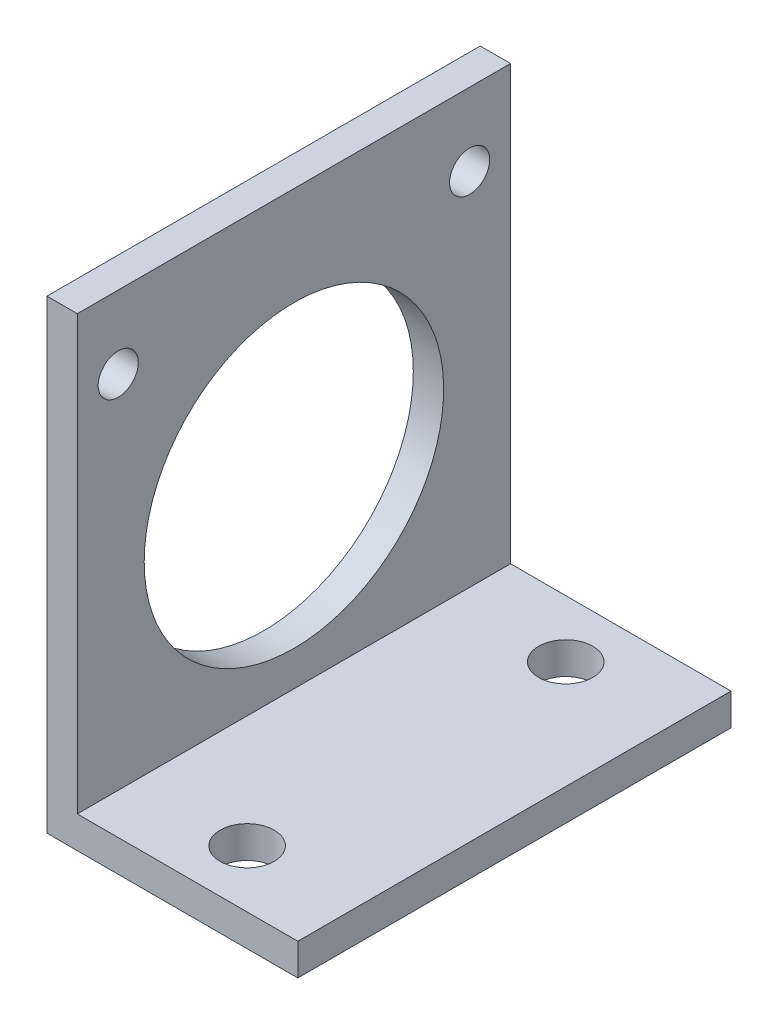
ISO-10303-21;
HEADER;
FILE_DESCRIPTION(('STEP AP214'),'2;1');
FILE_NAME('part.step','',(''),(''),'','','');
FILE_SCHEMA(('AUTOMOTIVE_DESIGN { 1 0 10303 214 1 1 1 1 }'));
ENDSEC;
DATA;
#1=APPLICATION_CONTEXT('core data for automotive mechanical design processes');
#2=APPLICATION_PROTOCOL_DEFINITION('international standard','automotive_design',2000,#1);
#3=PRODUCT_CONTEXT('',#1,'mechanical');
#4=PRODUCT('Part','Part','',(#3));
#5=PRODUCT_RELATED_PRODUCT_CATEGORY('part','',(#4));
#6=PRODUCT_DEFINITION_FORMATION('','',#4);
#7=PRODUCT_DEFINITION_CONTEXT('part definition',#1,'design');
#8=PRODUCT_DEFINITION('design','',#6,#7);
#9=PRODUCT_DEFINITION_SHAPE('','',#8);
#10=(LENGTH_UNIT() NAMED_UNIT(*) SI_UNIT(.MILLI.,.METRE.));
#11=(NAMED_UNIT(*) PLANE_ANGLE_UNIT() SI_UNIT($,.RADIAN.));
#12=(NAMED_UNIT(*) SI_UNIT($,.STERADIAN.) SOLID_ANGLE_UNIT());
#13=UNCERTAINTY_MEASURE_WITH_UNIT(LENGTH_MEASURE(1.E-05),#10,'distance_accuracy_value','');
#14=(GEOMETRIC_REPRESENTATION_CONTEXT(3) GLOBAL_UNCERTAINTY_ASSIGNED_CONTEXT((#13)) GLOBAL_UNIT_ASSIGNED_CONTEXT((#10,
#11,#12)) REPRESENTATION_CONTEXT('',''));
#15=CARTESIAN_POINT('',(0.,0.,0.));
#16=DIRECTION('',(0.,0.,1.));
#17=DIRECTION('',(1.,0.,0.));
#18=AXIS2_PLACEMENT_3D('',#15,#16,#17);
#19=CARTESIAN_POINT('',(0.,5.,0.));
#20=DIRECTION('',(0.,-1.,0.));
#21=DIRECTION('',(0.,0.,-1.));
#22=AXIS2_PLACEMENT_3D('',#19,#20,#21);
#23=PLANE('',#22);
#24=CARTESIAN_POINT('',(2.73500000000002,5.,-25.));
#25=DIRECTION('',(0.,1.,0.));
#26=DIRECTION('',(0.,0.,1.));
#27=AXIS2_PLACEMENT_3D('',#24,#25,#26);
#28=CIRCLE('',#27,4.25);
#29=CARTESIAN_POINT('',(2.73500000000001,5.,-20.75));
#30=VERTEX_POINT('',#29);
#31=EDGE_CURVE('E173',#30,#30,#28,.T.);
#32=ORIENTED_EDGE('',*,*,#31,.F.);
#33=EDGE_LOOP('',(#32));
#34=FACE_BOUND('',#33,.T.);
#35=CARTESIAN_POINT('',(2.73500000000002,5.,25.));
#36=DIRECTION('',(0.,1.,0.));
#37=DIRECTION('',(0.,0.,1.));
#38=AXIS2_PLACEMENT_3D('',#35,#36,#37);
#39=CIRCLE('',#38,4.25);
#40=CARTESIAN_POINT('',(2.73500000000001,5.,29.25));
#41=VERTEX_POINT('',#40);
#42=EDGE_CURVE('E107',#41,#41,#39,.T.);
#43=ORIENTED_EDGE('',*,*,#42,.F.);
#44=EDGE_LOOP('',(#43));
#45=FACE_BOUND('',#44,.T.);
#46=DIRECTION('',(0.,0.,-1.));
#47=VECTOR('',#46,1.);
#48=CARTESIAN_POINT('',(-14.9225,5.00000000000002,34.));
#49=LINE('',#48,#47);
#50=CARTESIAN_POINT('',(-14.9225,5.00000000000002,34.));
#51=VERTEX_POINT('',#50);
#52=CARTESIAN_POINT('',(-14.9225,5.00000000000002,-34.));
#53=VERTEX_POINT('',#52);
#54=EDGE_CURVE('E57',#51,#53,#49,.T.);
#55=ORIENTED_EDGE('',*,*,#54,.F.);
#56=DIRECTION('',(1.,0.,0.));
#57=VECTOR('',#56,1.);
#58=CARTESIAN_POINT('',(19.685,5.,34.));
#59=LINE('',#58,#57);
#60=CARTESIAN_POINT('',(19.685,5.,34.));
#61=VERTEX_POINT('',#60);
#62=EDGE_CURVE('E184',#51,#61,#59,.T.);
#63=ORIENTED_EDGE('',*,*,#62,.T.);
#64=DIRECTION('',(0.,0.,-1.));
#65=VECTOR('',#64,1.);
#66=CARTESIAN_POINT('',(19.685,5.,34.));
#67=LINE('',#66,#65);
#68=CARTESIAN_POINT('',(19.685,5.,-34.));
#69=VERTEX_POINT('',#68);
#70=EDGE_CURVE('E63',#61,#69,#67,.T.);
#71=ORIENTED_EDGE('',*,*,#70,.T.);
#72=DIRECTION('',(-1.,0.,0.));
#73=VECTOR('',#72,1.);
#74=CARTESIAN_POINT('',(19.685,5.,-34.));
#75=LINE('',#74,#73);
#76=EDGE_CURVE('E93',#69,#53,#75,.T.);
#77=ORIENTED_EDGE('',*,*,#76,.T.);
#78=EDGE_LOOP('',(#55,#63,#71,#77));
#79=FACE_BOUND('',#78,.T.);
#80=ADVANCED_FACE('F40',(#34,#45,#79),#23,.F.);
#81=CARTESIAN_POINT('',(0.,0.,0.));
#82=DIRECTION('',(0.,-1.,0.));
#83=DIRECTION('',(0.,0.,-1.));
#84=AXIS2_PLACEMENT_3D('',#81,#82,#83);
#85=PLANE('',#84);
#86=CARTESIAN_POINT('',(2.73500000000002,0.,25.));
#87=DIRECTION('',(0.,1.,0.));
#88=DIRECTION('',(0.,0.,1.));
#89=AXIS2_PLACEMENT_3D('',#86,#87,#88);
#90=CIRCLE('',#89,4.25);
#91=CARTESIAN_POINT('',(2.73500000000001,0.,29.25));
#92=VERTEX_POINT('',#91);
#93=EDGE_CURVE('E114',#92,#92,#90,.T.);
#94=ORIENTED_EDGE('',*,*,#93,.T.);
#95=EDGE_LOOP('',(#94));
#96=FACE_BOUND('',#95,.T.);
#97=DIRECTION('',(-1.,0.,0.));
#98=VECTOR('',#97,1.);
#99=CARTESIAN_POINT('',(19.685,0.,-34.));
#100=LINE('',#99,#98);
#101=CARTESIAN_POINT('',(19.685,0.,-34.));
#102=VERTEX_POINT('',#101);
#103=CARTESIAN_POINT('',(-19.685,0.,-34.));
#104=VERTEX_POINT('',#103);
#105=EDGE_CURVE('E99',#102,#104,#100,.T.);
#106=ORIENTED_EDGE('',*,*,#105,.F.);
#107=DIRECTION('',(0.,0.,-1.));
#108=VECTOR('',#107,1.);
#109=CARTESIAN_POINT('',(19.685,0.,34.));
#110=LINE('',#109,#108);
#111=CARTESIAN_POINT('',(19.685,0.,34.));
#112=VERTEX_POINT('',#111);
#113=EDGE_CURVE('E82',#112,#102,#110,.T.);
#114=ORIENTED_EDGE('',*,*,#113,.F.);
#115=DIRECTION('',(1.,0.,0.));
#116=VECTOR('',#115,1.);
#117=CARTESIAN_POINT('',(19.685,0.,34.));
#118=LINE('',#117,#116);
#119=CARTESIAN_POINT('',(-19.685,0.,34.));
#120=VERTEX_POINT('',#119);
#121=EDGE_CURVE('E94',#120,#112,#118,.T.);
#122=ORIENTED_EDGE('',*,*,#121,.F.);
#123=DIRECTION('',(0.,0.,1.));
#124=VECTOR('',#123,1.);
#125=CARTESIAN_POINT('',(-19.685,0.,34.));
#126=LINE('',#125,#124);
#127=EDGE_CURVE('E105',#104,#120,#126,.T.);
#128=ORIENTED_EDGE('',*,*,#127,.F.);
#129=EDGE_LOOP('',(#106,#114,#122,#128));
#130=FACE_BOUND('',#129,.T.);
#131=CARTESIAN_POINT('',(2.73500000000002,0.,-25.));
#132=DIRECTION('',(0.,1.,0.));
#133=DIRECTION('',(0.,0.,1.));
#134=AXIS2_PLACEMENT_3D('',#131,#132,#133);
#135=CIRCLE('',#134,4.25);
#136=CARTESIAN_POINT('',(2.73500000000001,0.,-20.75));
#137=VERTEX_POINT('',#136);
#138=EDGE_CURVE('E172',#137,#137,#135,.T.);
#139=ORIENTED_EDGE('',*,*,#138,.T.);
#140=EDGE_LOOP('',(#139));
#141=FACE_BOUND('',#140,.T.);
#142=ADVANCED_FACE('F103',(#96,#130,#141),#85,.T.);
#143=CARTESIAN_POINT('',(19.685,5.,-34.));
#144=DIRECTION('',(0.,0.,1.));
#145=DIRECTION('',(1.,0.,0.));
#146=AXIS2_PLACEMENT_3D('',#143,#144,#145);
#147=PLANE('',#146);
#148=ORIENTED_EDGE('',*,*,#105,.T.);
#149=DIRECTION('',(0.,-1.,0.));
#150=VECTOR('',#149,1.);
#151=CARTESIAN_POINT('',(-19.685,5.,-34.));
#152=LINE('',#151,#150);
#153=CARTESIAN_POINT('',(-19.685,73.,-34.));
#154=VERTEX_POINT('',#153);
#155=EDGE_CURVE('E11',#154,#104,#152,.T.);
#156=ORIENTED_EDGE('',*,*,#155,.F.);
#157=DIRECTION('',(-1.,0.,0.));
#158=VECTOR('',#157,1.);
#159=CARTESIAN_POINT('',(-14.9225,73.,-34.));
#160=LINE('',#159,#158);
#161=CARTESIAN_POINT('',(-14.9225,73.,-34.));
#162=VERTEX_POINT('',#161);
#163=EDGE_CURVE('E149',#162,#154,#160,.T.);
#164=ORIENTED_EDGE('',*,*,#163,.F.);
#165=DIRECTION('',(0.,-1.,0.));
#166=VECTOR('',#165,1.);
#167=CARTESIAN_POINT('',(-14.9225,73.,-34.));
#168=LINE('',#167,#166);
#169=EDGE_CURVE('E156',#162,#53,#168,.T.);
#170=ORIENTED_EDGE('',*,*,#169,.T.);
#171=ORIENTED_EDGE('',*,*,#76,.F.);
#172=DIRECTION('',(0.,-1.,0.));
#173=VECTOR('',#172,1.);
#174=CARTESIAN_POINT('',(19.685,5.,-34.));
#175=LINE('',#174,#173);
#176=EDGE_CURVE('E85',#69,#102,#175,.T.);
#177=ORIENTED_EDGE('',*,*,#176,.T.);
#178=EDGE_LOOP('',(#148,#156,#164,#170,#171,#177));
#179=FACE_BOUND('',#178,.T.);
#180=ADVANCED_FACE('F42',(#179),#147,.F.);
#181=CARTESIAN_POINT('',(-19.685,5.00000000000001,34.));
#182=DIRECTION('',(1.,0.,0.));
#183=DIRECTION('',(0.,0.,-1.));
#184=AXIS2_PLACEMENT_3D('',#181,#182,#183);
#185=PLANE('',#184);
#186=CARTESIAN_POINT('',(-19.685,34.,0.));
#187=DIRECTION('',(-1.,0.,0.));
#188=DIRECTION('',(0.,0.,1.));
#189=AXIS2_PLACEMENT_3D('',#186,#187,#188);
#190=CIRCLE('',#189,23.5);
#191=CARTESIAN_POINT('',(-19.685,34.,23.5));
#192=VERTEX_POINT('',#191);
#193=EDGE_CURVE('E231',#192,#192,#190,.T.);
#194=ORIENTED_EDGE('',*,*,#193,.F.);
#195=EDGE_LOOP('',(#194));
#196=FACE_BOUND('',#195,.T.);
#197=CARTESIAN_POINT('',(-19.685,61.5771644662753,27.5771644662746));
#198=DIRECTION('',(1.,0.,0.));
#199=DIRECTION('',(0.,1.,0.));
#200=AXIS2_PLACEMENT_3D('',#197,#198,#199);
#201=CIRCLE('',#200,3.14999999999925);
#202=CARTESIAN_POINT('',(-19.685,64.7271644662745,27.5771644662746));
#203=VERTEX_POINT('',#202);
#204=EDGE_CURVE('E167',#203,#203,#201,.T.);
#205=ORIENTED_EDGE('',*,*,#204,.T.);
#206=EDGE_LOOP('',(#205));
#207=FACE_BOUND('',#206,.T.);
#208=CARTESIAN_POINT('',(-19.685,61.5771644662757,-27.5771644662759));
#209=DIRECTION('',(1.,0.,0.));
#210=DIRECTION('',(0.,1.,0.));
#211=AXIS2_PLACEMENT_3D('',#208,#209,#210);
#212=CIRCLE('',#211,3.14999999999875);
#213=CARTESIAN_POINT('',(-19.685,64.7271644662744,-27.5771644662759));
#214=VERTEX_POINT('',#213);
#215=EDGE_CURVE('E237',#214,#214,#212,.T.);
#216=ORIENTED_EDGE('',*,*,#215,.T.);
#217=EDGE_LOOP('',(#216));
#218=FACE_BOUND('',#217,.T.);
#219=ORIENTED_EDGE('',*,*,#127,.T.);
#220=DIRECTION('',(0.,-1.,0.));
#221=VECTOR('',#220,1.);
#222=CARTESIAN_POINT('',(-19.685,5.00000000000001,34.));
#223=LINE('',#222,#221);
#224=CARTESIAN_POINT('',(-19.685,73.,34.));
#225=VERTEX_POINT('',#224);
#226=EDGE_CURVE('E50',#225,#120,#223,.T.);
#227=ORIENTED_EDGE('',*,*,#226,.F.);
#228=DIRECTION('',(0.,0.,1.));
#229=VECTOR('',#228,1.);
#230=CARTESIAN_POINT('',(-19.685,73.,-34.));
#231=LINE('',#230,#229);
#232=EDGE_CURVE('E138',#154,#225,#231,.T.);
#233=ORIENTED_EDGE('',*,*,#232,.F.);
#234=ORIENTED_EDGE('',*,*,#155,.T.);
#235=EDGE_LOOP('',(#219,#227,#233,#234));
#236=FACE_BOUND('',#235,.T.);
#237=ADVANCED_FACE('F137',(#196,#207,#218,#236),#185,.F.);
#238=CARTESIAN_POINT('',(19.685,5.,34.));
#239=DIRECTION('',(0.,0.,-1.));
#240=DIRECTION('',(-1.,0.,0.));
#241=AXIS2_PLACEMENT_3D('',#238,#239,#240);
#242=PLANE('',#241);
#243=ORIENTED_EDGE('',*,*,#121,.T.);
#244=DIRECTION('',(0.,-1.,0.));
#245=VECTOR('',#244,1.);
#246=CARTESIAN_POINT('',(19.685,5.,34.));
#247=LINE('',#246,#245);
#248=EDGE_CURVE('E88',#61,#112,#247,.T.);
#249=ORIENTED_EDGE('',*,*,#248,.F.);
#250=ORIENTED_EDGE('',*,*,#62,.F.);
#251=DIRECTION('',(0.,-1.,0.));
#252=VECTOR('',#251,1.);
#253=CARTESIAN_POINT('',(-14.9225,73.,34.));
#254=LINE('',#253,#252);
#255=CARTESIAN_POINT('',(-14.9225,73.,34.));
#256=VERTEX_POINT('',#255);
#257=EDGE_CURVE('E161',#256,#51,#254,.T.);
#258=ORIENTED_EDGE('',*,*,#257,.F.);
#259=DIRECTION('',(1.,0.,0.));
#260=VECTOR('',#259,1.);
#261=CARTESIAN_POINT('',(-19.685,73.,34.));
#262=LINE('',#261,#260);
#263=EDGE_CURVE('E133',#225,#256,#262,.T.);
#264=ORIENTED_EDGE('',*,*,#263,.F.);
#265=ORIENTED_EDGE('',*,*,#226,.T.);
#266=EDGE_LOOP('',(#243,#249,#250,#258,#264,#265));
#267=FACE_BOUND('',#266,.T.);
#268=ADVANCED_FACE('F129',(#267),#242,.F.);
#269=CARTESIAN_POINT('',(19.685,5.,34.));
#270=DIRECTION('',(-1.,0.,0.));
#271=DIRECTION('',(0.,0.,1.));
#272=AXIS2_PLACEMENT_3D('',#269,#270,#271);
#273=PLANE('',#272);
#274=ORIENTED_EDGE('',*,*,#113,.T.);
#275=ORIENTED_EDGE('',*,*,#176,.F.);
#276=ORIENTED_EDGE('',*,*,#70,.F.);
#277=ORIENTED_EDGE('',*,*,#248,.T.);
#278=EDGE_LOOP('',(#274,#275,#276,#277));
#279=FACE_BOUND('',#278,.T.);
#280=ADVANCED_FACE('F84',(#279),#273,.F.);
#281=CARTESIAN_POINT('',(2.73500000000002,5.,25.));
#282=DIRECTION('',(0.,-1.,0.));
#283=DIRECTION('',(0.,0.,-1.));
#284=AXIS2_PLACEMENT_3D('',#281,#282,#283);
#285=CYLINDRICAL_SURFACE('',#284,4.25);
#286=ORIENTED_EDGE('',*,*,#42,.T.);
#287=EDGE_LOOP('',(#286));
#288=FACE_BOUND('',#287,.T.);
#289=ORIENTED_EDGE('',*,*,#93,.F.);
#290=EDGE_LOOP('',(#289));
#291=FACE_BOUND('',#290,.T.);
#292=ADVANCED_FACE('F203',(#288,#291),#285,.F.);
#293=CARTESIAN_POINT('',(2.73500000000002,5.,-25.));
#294=DIRECTION('',(0.,-1.,0.));
#295=DIRECTION('',(0.,0.,-1.));
#296=AXIS2_PLACEMENT_3D('',#293,#294,#295);
#297=CYLINDRICAL_SURFACE('',#296,4.25);
#298=ORIENTED_EDGE('',*,*,#31,.T.);
#299=EDGE_LOOP('',(#298));
#300=FACE_BOUND('',#299,.T.);
#301=ORIENTED_EDGE('',*,*,#138,.F.);
#302=EDGE_LOOP('',(#301));
#303=FACE_BOUND('',#302,.T.);
#304=ADVANCED_FACE('F194',(#300,#303),#297,.F.);
#305=CARTESIAN_POINT('',(-14.9225,73.,34.));
#306=DIRECTION('',(-1.,0.,0.));
#307=DIRECTION('',(0.,-1.,0.));
#308=AXIS2_PLACEMENT_3D('',#305,#306,#307);
#309=PLANE('',#308);
#310=CARTESIAN_POINT('',(-14.9225,34.,0.));
#311=DIRECTION('',(-1.,0.,0.));
#312=DIRECTION('',(0.,-1.,0.));
#313=AXIS2_PLACEMENT_3D('',#310,#311,#312);
#314=CIRCLE('',#313,23.5);
#315=CARTESIAN_POINT('',(-14.9225,10.5,0.));
#316=VERTEX_POINT('',#315);
#317=EDGE_CURVE('E44',#316,#316,#314,.T.);
#318=ORIENTED_EDGE('',*,*,#317,.T.);
#319=EDGE_LOOP('',(#318));
#320=FACE_BOUND('',#319,.T.);
#321=CARTESIAN_POINT('',(-14.9225,61.5771644662753,27.5771644662746));
#322=DIRECTION('',(1.,0.,0.));
#323=DIRECTION('',(0.,1.,0.));
#324=AXIS2_PLACEMENT_3D('',#321,#322,#323);
#325=CIRCLE('',#324,3.14999999999925);
#326=CARTESIAN_POINT('',(-14.9225,64.7271644662746,27.5771644662746));
#327=VERTEX_POINT('',#326);
#328=EDGE_CURVE('E240',#327,#327,#325,.T.);
#329=ORIENTED_EDGE('',*,*,#328,.F.);
#330=EDGE_LOOP('',(#329));
#331=FACE_BOUND('',#330,.T.);
#332=CARTESIAN_POINT('',(-14.9225,61.5771644662757,-27.5771644662758));
#333=DIRECTION('',(1.,0.,0.));
#334=DIRECTION('',(0.,1.,0.));
#335=AXIS2_PLACEMENT_3D('',#332,#333,#334);
#336=CIRCLE('',#335,3.14999999999875);
#337=CARTESIAN_POINT('',(-14.9225,64.7271644662744,-27.5771644662758));
#338=VERTEX_POINT('',#337);
#339=EDGE_CURVE('E241',#338,#338,#336,.T.);
#340=ORIENTED_EDGE('',*,*,#339,.F.);
#341=EDGE_LOOP('',(#340));
#342=FACE_BOUND('',#341,.T.);
#343=ORIENTED_EDGE('',*,*,#54,.T.);
#344=ORIENTED_EDGE('',*,*,#169,.F.);
#345=DIRECTION('',(0.,0.,-1.));
#346=VECTOR('',#345,1.);
#347=CARTESIAN_POINT('',(-14.9225,73.,34.));
#348=LINE('',#347,#346);
#349=EDGE_CURVE('E153',#256,#162,#348,.T.);
#350=ORIENTED_EDGE('',*,*,#349,.F.);
#351=ORIENTED_EDGE('',*,*,#257,.T.);
#352=EDGE_LOOP('',(#343,#344,#350,#351));
#353=FACE_BOUND('',#352,.T.);
#354=ADVANCED_FACE('F192',(#320,#331,#342,#353),#309,.F.);
#355=CARTESIAN_POINT('',(0.,73.,0.));
#356=DIRECTION('',(0.,1.,0.));
#357=DIRECTION('',(0.,0.,1.));
#358=AXIS2_PLACEMENT_3D('',#355,#356,#357);
#359=PLANE('',#358);
#360=ORIENTED_EDGE('',*,*,#232,.T.);
#361=ORIENTED_EDGE('',*,*,#263,.T.);
#362=ORIENTED_EDGE('',*,*,#349,.T.);
#363=ORIENTED_EDGE('',*,*,#163,.T.);
#364=EDGE_LOOP('',(#360,#361,#362,#363));
#365=FACE_BOUND('',#364,.T.);
#366=ADVANCED_FACE('F151',(#365),#359,.T.);
#367=CARTESIAN_POINT('',(-19.685,61.5771644662757,-27.5771644662759));
#368=DIRECTION('',(1.,0.,0.));
#369=DIRECTION('',(0.,1.,0.));
#370=AXIS2_PLACEMENT_3D('',#367,#368,#369);
#371=CYLINDRICAL_SURFACE('',#370,3.14999999999875);
#372=ORIENTED_EDGE('',*,*,#215,.F.);
#373=EDGE_LOOP('',(#372));
#374=FACE_BOUND('',#373,.T.);
#375=ORIENTED_EDGE('',*,*,#339,.T.);
#376=EDGE_LOOP('',(#375));
#377=FACE_BOUND('',#376,.T.);
#378=ADVANCED_FACE('F201',(#374,#377),#371,.F.);
#379=CARTESIAN_POINT('',(-19.685,61.5771644662753,27.5771644662746));
#380=DIRECTION('',(1.,0.,0.));
#381=DIRECTION('',(0.,1.,0.));
#382=AXIS2_PLACEMENT_3D('',#379,#380,#381);
#383=CYLINDRICAL_SURFACE('',#382,3.14999999999925);
#384=ORIENTED_EDGE('',*,*,#204,.F.);
#385=EDGE_LOOP('',(#384));
#386=FACE_BOUND('',#385,.T.);
#387=ORIENTED_EDGE('',*,*,#328,.T.);
#388=EDGE_LOOP('',(#387));
#389=FACE_BOUND('',#388,.T.);
#390=ADVANCED_FACE('F270',(#386,#389),#383,.F.);
#391=CARTESIAN_POINT('',(19.685,34.,0.));
#392=DIRECTION('',(-1.,0.,0.));
#393=DIRECTION('',(0.,0.,1.));
#394=AXIS2_PLACEMENT_3D('',#391,#392,#393);
#395=CYLINDRICAL_SURFACE('',#394,23.5);
#396=ORIENTED_EDGE('',*,*,#193,.T.);
#397=EDGE_LOOP('',(#396));
#398=FACE_BOUND('',#397,.T.);
#399=ORIENTED_EDGE('',*,*,#317,.F.);
#400=EDGE_LOOP('',(#399));
#401=FACE_BOUND('',#400,.T.);
#402=ADVANCED_FACE('F267',(#398,#401),#395,.F.);
#403=CLOSED_SHELL('',(#80,#142,#180,#237,#268,#280,#292,#304,#354,#366,#378,#390,#402));
#404=MANIFOLD_SOLID_BREP('B2',#403);
#405=ADVANCED_BREP_SHAPE_REPRESENTATION('',(#18,#404),#14);
#406=SHAPE_DEFINITION_REPRESENTATION(#9,#405);
ENDSEC;
END-ISO-10303-21;
